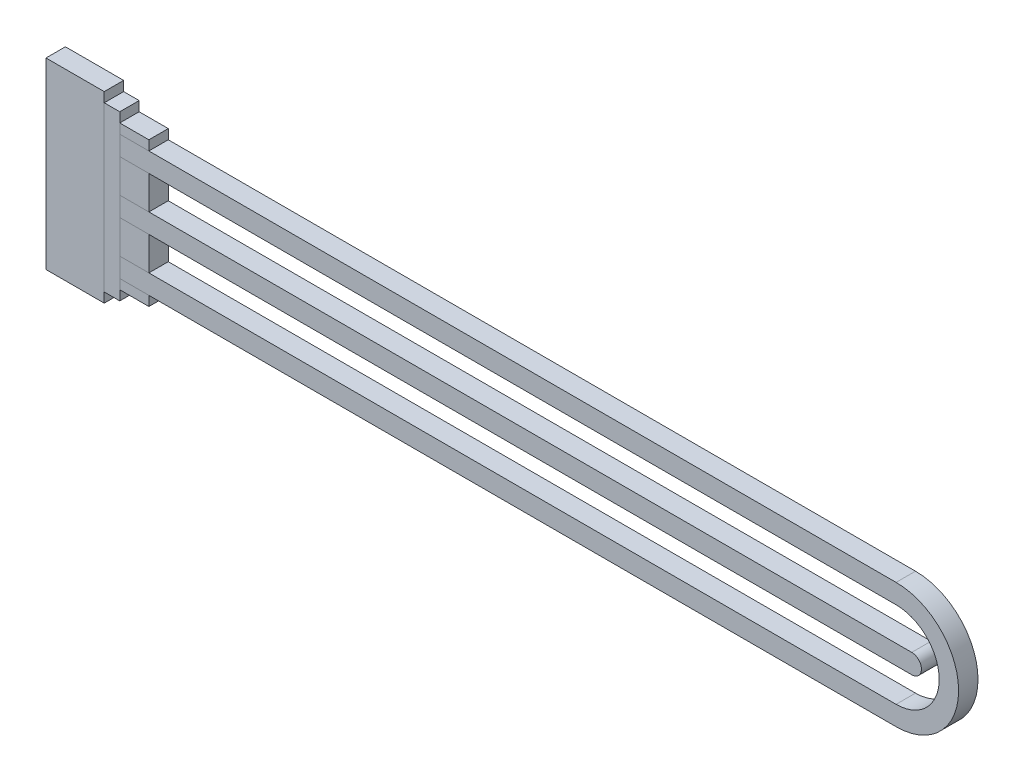
ISO-10303-21;
HEADER;
FILE_DESCRIPTION(('STEP AP214'),'2;1');
FILE_NAME('part.step','',(''),(''),'','','');
FILE_SCHEMA(('AUTOMOTIVE_DESIGN { 1 0 10303 214 1 1 1 1 }'));
ENDSEC;
DATA;
#1=APPLICATION_CONTEXT('core data for automotive mechanical design processes');
#2=APPLICATION_PROTOCOL_DEFINITION('international standard','automotive_design',2000,#1);
#3=PRODUCT_CONTEXT('',#1,'mechanical');
#4=PRODUCT('Part','Part','',(#3));
#5=PRODUCT_RELATED_PRODUCT_CATEGORY('part','',(#4));
#6=PRODUCT_DEFINITION_FORMATION('','',#4);
#7=PRODUCT_DEFINITION_CONTEXT('part definition',#1,'design');
#8=PRODUCT_DEFINITION('design','',#6,#7);
#9=PRODUCT_DEFINITION_SHAPE('','',#8);
#10=(LENGTH_UNIT() NAMED_UNIT(*) SI_UNIT(.MILLI.,.METRE.));
#11=(NAMED_UNIT(*) PLANE_ANGLE_UNIT() SI_UNIT($,.RADIAN.));
#12=(NAMED_UNIT(*) SI_UNIT($,.STERADIAN.) SOLID_ANGLE_UNIT());
#13=UNCERTAINTY_MEASURE_WITH_UNIT(LENGTH_MEASURE(1.E-05),#10,'distance_accuracy_value','');
#14=(GEOMETRIC_REPRESENTATION_CONTEXT(3) GLOBAL_UNCERTAINTY_ASSIGNED_CONTEXT((#13)) GLOBAL_UNIT_ASSIGNED_CONTEXT((#10,
#11,#12)) REPRESENTATION_CONTEXT('',''));
#15=CARTESIAN_POINT('',(0.,0.,0.));
#16=DIRECTION('',(0.,0.,1.));
#17=DIRECTION('',(1.,0.,0.));
#18=AXIS2_PLACEMENT_3D('',#15,#16,#17);
#19=CARTESIAN_POINT('',(-38.,15.,9.99999999999998));
#20=DIRECTION('',(0.,0.,-1.));
#21=DIRECTION('',(-1.,0.,0.));
#22=AXIS2_PLACEMENT_3D('',#19,#20,#21);
#23=PLANE('',#22);
#24=DIRECTION('',(0.,1.,0.));
#25=VECTOR('',#24,1.);
#26=CARTESIAN_POINT('',(-7.99999999999999,15.,9.99999999999998));
#27=LINE('',#26,#25);
#28=CARTESIAN_POINT('',(-7.99999999999999,-79.4096844460773,9.99999999999998));
#29=VERTEX_POINT('',#28);
#30=CARTESIAN_POINT('',(-7.99999999999999,15.,9.99999999999998));
#31=VERTEX_POINT('',#30);
#32=EDGE_CURVE('E115',#29,#31,#27,.T.);
#33=ORIENTED_EDGE('',*,*,#32,.T.);
#34=DIRECTION('',(1.,0.,0.));
#35=VECTOR('',#34,1.);
#36=CARTESIAN_POINT('',(-38.,15.,9.99999999999998));
#37=LINE('',#36,#35);
#38=CARTESIAN_POINT('',(-38.,15.,9.99999999999998));
#39=VERTEX_POINT('',#38);
#40=EDGE_CURVE('E12',#39,#31,#37,.T.);
#41=ORIENTED_EDGE('',*,*,#40,.F.);
#42=DIRECTION('',(0.,1.,0.));
#43=VECTOR('',#42,1.);
#44=CARTESIAN_POINT('',(-38.,15.,9.99999999999998));
#45=LINE('',#44,#43);
#46=CARTESIAN_POINT('',(-38.,-79.4096844460773,9.99999999999998));
#47=VERTEX_POINT('',#46);
#48=EDGE_CURVE('E103',#47,#39,#45,.T.);
#49=ORIENTED_EDGE('',*,*,#48,.F.);
#50=DIRECTION('',(1.,0.,0.));
#51=VECTOR('',#50,1.);
#52=CARTESIAN_POINT('',(-38.,-79.4096844460773,9.99999999999998));
#53=LINE('',#52,#51);
#54=EDGE_CURVE('E111',#47,#29,#53,.T.);
#55=ORIENTED_EDGE('',*,*,#54,.T.);
#56=EDGE_LOOP('',(#33,#41,#49,#55));
#57=FACE_BOUND('',#56,.T.);
#58=ADVANCED_FACE('F52',(#57),#23,.F.);
#59=CARTESIAN_POINT('',(-38.,15.,0.));
#60=DIRECTION('',(0.,-1.,0.));
#61=DIRECTION('',(0.,0.,-1.));
#62=AXIS2_PLACEMENT_3D('',#59,#60,#61);
#63=PLANE('',#62);
#64=DIRECTION('',(0.,0.,-1.));
#65=VECTOR('',#64,1.);
#66=CARTESIAN_POINT('',(-7.99999999999999,15.,0.));
#67=LINE('',#66,#65);
#68=CARTESIAN_POINT('',(-7.99999999999999,15.,0.));
#69=VERTEX_POINT('',#68);
#70=EDGE_CURVE('E107',#31,#69,#67,.T.);
#71=ORIENTED_EDGE('',*,*,#70,.T.);
#72=DIRECTION('',(1.,0.,0.));
#73=VECTOR('',#72,1.);
#74=CARTESIAN_POINT('',(-38.,15.,0.));
#75=LINE('',#74,#73);
#76=CARTESIAN_POINT('',(-38.,15.,0.));
#77=VERTEX_POINT('',#76);
#78=EDGE_CURVE('E60',#77,#69,#75,.T.);
#79=ORIENTED_EDGE('',*,*,#78,.F.);
#80=DIRECTION('',(0.,0.,-1.));
#81=VECTOR('',#80,1.);
#82=CARTESIAN_POINT('',(-38.,15.,0.));
#83=LINE('',#82,#81);
#84=EDGE_CURVE('E98',#39,#77,#83,.T.);
#85=ORIENTED_EDGE('',*,*,#84,.F.);
#86=ORIENTED_EDGE('',*,*,#40,.T.);
#87=EDGE_LOOP('',(#71,#79,#85,#86));
#88=FACE_BOUND('',#87,.T.);
#89=ADVANCED_FACE('F106',(#88),#63,.F.);
#90=CARTESIAN_POINT('',(-38.,15.,0.));
#91=DIRECTION('',(0.,0.,1.));
#92=DIRECTION('',(0.,-1.,0.));
#93=AXIS2_PLACEMENT_3D('',#90,#91,#92);
#94=PLANE('',#93);
#95=DIRECTION('',(0.,-1.,0.));
#96=VECTOR('',#95,1.);
#97=CARTESIAN_POINT('',(-7.99999999999999,15.,0.));
#98=LINE('',#97,#96);
#99=CARTESIAN_POINT('',(-7.99999999999999,-79.4096844460773,0.));
#100=VERTEX_POINT('',#99);
#101=EDGE_CURVE('E85',#69,#100,#98,.T.);
#102=ORIENTED_EDGE('',*,*,#101,.T.);
#103=DIRECTION('',(1.,0.,0.));
#104=VECTOR('',#103,1.);
#105=CARTESIAN_POINT('',(-38.,-79.4096844460773,0.));
#106=LINE('',#105,#104);
#107=CARTESIAN_POINT('',(-38.,-79.4096844460773,0.));
#108=VERTEX_POINT('',#107);
#109=EDGE_CURVE('E108',#108,#100,#106,.T.);
#110=ORIENTED_EDGE('',*,*,#109,.F.);
#111=DIRECTION('',(0.,-1.,0.));
#112=VECTOR('',#111,1.);
#113=CARTESIAN_POINT('',(-38.,15.,0.));
#114=LINE('',#113,#112);
#115=EDGE_CURVE('E101',#77,#108,#114,.T.);
#116=ORIENTED_EDGE('',*,*,#115,.F.);
#117=ORIENTED_EDGE('',*,*,#78,.T.);
#118=EDGE_LOOP('',(#102,#110,#116,#117));
#119=FACE_BOUND('',#118,.T.);
#120=ADVANCED_FACE('F109',(#119),#94,.F.);
#121=CARTESIAN_POINT('',(-38.,-79.4096844460773,0.));
#122=DIRECTION('',(0.,1.,0.));
#123=DIRECTION('',(0.,0.,1.));
#124=AXIS2_PLACEMENT_3D('',#121,#122,#123);
#125=PLANE('',#124);
#126=DIRECTION('',(0.,0.,1.));
#127=VECTOR('',#126,1.);
#128=CARTESIAN_POINT('',(-7.99999999999999,-79.4096844460773,0.));
#129=LINE('',#128,#127);
#130=EDGE_CURVE('E91',#100,#29,#129,.T.);
#131=ORIENTED_EDGE('',*,*,#130,.T.);
#132=ORIENTED_EDGE('',*,*,#54,.F.);
#133=DIRECTION('',(0.,0.,1.));
#134=VECTOR('',#133,1.);
#135=CARTESIAN_POINT('',(-38.,-79.4096844460773,0.));
#136=LINE('',#135,#134);
#137=EDGE_CURVE('E68',#108,#47,#136,.T.);
#138=ORIENTED_EDGE('',*,*,#137,.F.);
#139=ORIENTED_EDGE('',*,*,#109,.T.);
#140=EDGE_LOOP('',(#131,#132,#138,#139));
#141=FACE_BOUND('',#140,.T.);
#142=ADVANCED_FACE('F122',(#141),#125,.F.);
#143=CARTESIAN_POINT('',(-38.,0.,0.));
#144=DIRECTION('',(-1.,0.,0.));
#145=DIRECTION('',(0.,0.,1.));
#146=AXIS2_PLACEMENT_3D('',#143,#144,#145);
#147=PLANE('',#146);
#148=ORIENTED_EDGE('',*,*,#48,.T.);
#149=ORIENTED_EDGE('',*,*,#84,.T.);
#150=ORIENTED_EDGE('',*,*,#115,.T.);
#151=ORIENTED_EDGE('',*,*,#137,.T.);
#152=EDGE_LOOP('',(#148,#149,#150,#151));
#153=FACE_BOUND('',#152,.T.);
#154=ADVANCED_FACE('F99',(#153),#147,.T.);
#155=CARTESIAN_POINT('',(-7.99999999999999,0.,0.));
#156=DIRECTION('',(-1.,0.,0.));
#157=DIRECTION('',(0.,0.,1.));
#158=AXIS2_PLACEMENT_3D('',#155,#156,#157);
#159=PLANE('',#158);
#160=ORIENTED_EDGE('',*,*,#32,.F.);
#161=ORIENTED_EDGE('',*,*,#130,.F.);
#162=ORIENTED_EDGE('',*,*,#101,.F.);
#163=ORIENTED_EDGE('',*,*,#70,.F.);
#164=EDGE_LOOP('',(#160,#161,#162,#163));
#165=FACE_BOUND('',#164,.T.);
#166=ADVANCED_FACE('F125',(#165),#159,.F.);
#167=CLOSED_SHELL('',(#58,#89,#120,#142,#154,#166));
#168=MANIFOLD_SOLID_BREP('B2',#167);
#169=CARTESIAN_POINT('',(-7.99999999999999,10.,9.99999999999998));
#170=DIRECTION('',(0.,0.,-1.));
#171=DIRECTION('',(-1.,0.,0.));
#172=AXIS2_PLACEMENT_3D('',#169,#170,#171);
#173=PLANE('',#172);
#174=DIRECTION('',(0.,1.,0.));
#175=VECTOR('',#174,1.);
#176=CARTESIAN_POINT('',(0.,10.,9.99999999999998));
#177=LINE('',#176,#175);
#178=CARTESIAN_POINT('',(0.,-74.4096844460773,9.99999999999998));
#179=VERTEX_POINT('',#178);
#180=CARTESIAN_POINT('',(0.,10.,9.99999999999998));
#181=VERTEX_POINT('',#180);
#182=EDGE_CURVE('E261',#179,#181,#177,.T.);
#183=ORIENTED_EDGE('',*,*,#182,.T.);
#184=DIRECTION('',(1.,0.,0.));
#185=VECTOR('',#184,1.);
#186=CARTESIAN_POINT('',(-7.99999999999999,10.,9.99999999999998));
#187=LINE('',#186,#185);
#188=CARTESIAN_POINT('',(-7.99999999999999,10.,9.99999999999998));
#189=VERTEX_POINT('',#188);
#190=EDGE_CURVE('E50',#189,#181,#187,.T.);
#191=ORIENTED_EDGE('',*,*,#190,.F.);
#192=DIRECTION('',(0.,1.,0.));
#193=VECTOR('',#192,1.);
#194=CARTESIAN_POINT('',(-7.99999999999999,10.,9.99999999999998));
#195=LINE('',#194,#193);
#196=CARTESIAN_POINT('',(-7.99999999999999,-74.4096844460773,9.99999999999998));
#197=VERTEX_POINT('',#196);
#198=EDGE_CURVE('E249',#197,#189,#195,.T.);
#199=ORIENTED_EDGE('',*,*,#198,.F.);
#200=DIRECTION('',(1.,0.,0.));
#201=VECTOR('',#200,1.);
#202=CARTESIAN_POINT('',(-7.99999999999999,-74.4096844460773,9.99999999999998));
#203=LINE('',#202,#201);
#204=EDGE_CURVE('E257',#197,#179,#203,.T.);
#205=ORIENTED_EDGE('',*,*,#204,.T.);
#206=EDGE_LOOP('',(#183,#191,#199,#205));
#207=FACE_BOUND('',#206,.T.);
#208=ADVANCED_FACE('F198',(#207),#173,.F.);
#209=CARTESIAN_POINT('',(-7.99999999999999,10.,0.));
#210=DIRECTION('',(0.,-1.,0.));
#211=DIRECTION('',(0.,0.,-1.));
#212=AXIS2_PLACEMENT_3D('',#209,#210,#211);
#213=PLANE('',#212);
#214=DIRECTION('',(0.,0.,-1.));
#215=VECTOR('',#214,1.);
#216=CARTESIAN_POINT('',(0.,10.,0.));
#217=LINE('',#216,#215);
#218=CARTESIAN_POINT('',(0.,10.,0.));
#219=VERTEX_POINT('',#218);
#220=EDGE_CURVE('E253',#181,#219,#217,.T.);
#221=ORIENTED_EDGE('',*,*,#220,.T.);
#222=DIRECTION('',(1.,0.,0.));
#223=VECTOR('',#222,1.);
#224=CARTESIAN_POINT('',(-7.99999999999999,10.,0.));
#225=LINE('',#224,#223);
#226=CARTESIAN_POINT('',(-7.99999999999999,10.,0.));
#227=VERTEX_POINT('',#226);
#228=EDGE_CURVE('E206',#227,#219,#225,.T.);
#229=ORIENTED_EDGE('',*,*,#228,.F.);
#230=DIRECTION('',(0.,0.,-1.));
#231=VECTOR('',#230,1.);
#232=CARTESIAN_POINT('',(-7.99999999999999,10.,0.));
#233=LINE('',#232,#231);
#234=EDGE_CURVE('E244',#189,#227,#233,.T.);
#235=ORIENTED_EDGE('',*,*,#234,.F.);
#236=ORIENTED_EDGE('',*,*,#190,.T.);
#237=EDGE_LOOP('',(#221,#229,#235,#236));
#238=FACE_BOUND('',#237,.T.);
#239=ADVANCED_FACE('F252',(#238),#213,.F.);
#240=CARTESIAN_POINT('',(-7.99999999999999,10.,0.));
#241=DIRECTION('',(0.,0.,1.));
#242=DIRECTION('',(1.,0.,0.));
#243=AXIS2_PLACEMENT_3D('',#240,#241,#242);
#244=PLANE('',#243);
#245=DIRECTION('',(0.,-1.,0.));
#246=VECTOR('',#245,1.);
#247=CARTESIAN_POINT('',(0.,10.,0.));
#248=LINE('',#247,#246);
#249=CARTESIAN_POINT('',(0.,-74.4096844460773,0.));
#250=VERTEX_POINT('',#249);
#251=EDGE_CURVE('E231',#219,#250,#248,.T.);
#252=ORIENTED_EDGE('',*,*,#251,.T.);
#253=DIRECTION('',(1.,0.,0.));
#254=VECTOR('',#253,1.);
#255=CARTESIAN_POINT('',(-7.99999999999999,-74.4096844460773,0.));
#256=LINE('',#255,#254);
#257=CARTESIAN_POINT('',(-7.99999999999999,-74.4096844460773,0.));
#258=VERTEX_POINT('',#257);
#259=EDGE_CURVE('E254',#258,#250,#256,.T.);
#260=ORIENTED_EDGE('',*,*,#259,.F.);
#261=DIRECTION('',(0.,-1.,0.));
#262=VECTOR('',#261,1.);
#263=CARTESIAN_POINT('',(-7.99999999999999,10.,0.));
#264=LINE('',#263,#262);
#265=EDGE_CURVE('E247',#227,#258,#264,.T.);
#266=ORIENTED_EDGE('',*,*,#265,.F.);
#267=ORIENTED_EDGE('',*,*,#228,.T.);
#268=EDGE_LOOP('',(#252,#260,#266,#267));
#269=FACE_BOUND('',#268,.T.);
#270=ADVANCED_FACE('F255',(#269),#244,.F.);
#271=CARTESIAN_POINT('',(-7.99999999999999,-74.4096844460773,0.));
#272=DIRECTION('',(0.,1.,0.));
#273=DIRECTION('',(0.,0.,1.));
#274=AXIS2_PLACEMENT_3D('',#271,#272,#273);
#275=PLANE('',#274);
#276=DIRECTION('',(0.,0.,1.));
#277=VECTOR('',#276,1.);
#278=CARTESIAN_POINT('',(0.,-74.4096844460773,0.));
#279=LINE('',#278,#277);
#280=EDGE_CURVE('E237',#250,#179,#279,.T.);
#281=ORIENTED_EDGE('',*,*,#280,.T.);
#282=ORIENTED_EDGE('',*,*,#204,.F.);
#283=DIRECTION('',(0.,0.,1.));
#284=VECTOR('',#283,1.);
#285=CARTESIAN_POINT('',(-7.99999999999999,-74.4096844460773,0.));
#286=LINE('',#285,#284);
#287=EDGE_CURVE('E214',#258,#197,#286,.T.);
#288=ORIENTED_EDGE('',*,*,#287,.F.);
#289=ORIENTED_EDGE('',*,*,#259,.T.);
#290=EDGE_LOOP('',(#281,#282,#288,#289));
#291=FACE_BOUND('',#290,.T.);
#292=ADVANCED_FACE('F268',(#291),#275,.F.);
#293=CARTESIAN_POINT('',(-7.99999999999999,0.,0.));
#294=DIRECTION('',(-1.,0.,0.));
#295=DIRECTION('',(0.,0.,1.));
#296=AXIS2_PLACEMENT_3D('',#293,#294,#295);
#297=PLANE('',#296);
#298=ORIENTED_EDGE('',*,*,#198,.T.);
#299=ORIENTED_EDGE('',*,*,#234,.T.);
#300=ORIENTED_EDGE('',*,*,#265,.T.);
#301=ORIENTED_EDGE('',*,*,#287,.T.);
#302=EDGE_LOOP('',(#298,#299,#300,#301));
#303=FACE_BOUND('',#302,.T.);
#304=ADVANCED_FACE('F245',(#303),#297,.T.);
#305=CARTESIAN_POINT('',(0.,0.,0.));
#306=DIRECTION('',(-1.,0.,0.));
#307=DIRECTION('',(0.,0.,1.));
#308=AXIS2_PLACEMENT_3D('',#305,#306,#307);
#309=PLANE('',#308);
#310=ORIENTED_EDGE('',*,*,#182,.F.);
#311=ORIENTED_EDGE('',*,*,#280,.F.);
#312=ORIENTED_EDGE('',*,*,#251,.F.);
#313=ORIENTED_EDGE('',*,*,#220,.F.);
#314=EDGE_LOOP('',(#310,#311,#312,#313));
#315=FACE_BOUND('',#314,.T.);
#316=ADVANCED_FACE('F271',(#315),#309,.F.);
#317=CLOSED_SHELL('',(#208,#239,#270,#292,#304,#316));
#318=MANIFOLD_SOLID_BREP('B6',#317);
#319=CARTESIAN_POINT('',(15.,5.,10.));
#320=DIRECTION('',(0.,0.,-1.));
#321=DIRECTION('',(0.,1.,0.));
#322=AXIS2_PLACEMENT_3D('',#319,#320,#321);
#323=PLANE('',#322);
#324=DIRECTION('',(0.,-1.,0.));
#325=VECTOR('',#324,1.);
#326=CARTESIAN_POINT('',(0.,5.,10.));
#327=LINE('',#326,#325);
#328=CARTESIAN_POINT('',(0.,5.,10.));
#329=VERTEX_POINT('',#328);
#330=CARTESIAN_POINT('',(0.,-69.4096844460773,10.));
#331=VERTEX_POINT('',#330);
#332=EDGE_CURVE('E405',#329,#331,#327,.T.);
#333=ORIENTED_EDGE('',*,*,#332,.T.);
#334=DIRECTION('',(-1.,0.,0.));
#335=VECTOR('',#334,1.);
#336=CARTESIAN_POINT('',(15.,-69.4096844460773,10.));
#337=LINE('',#336,#335);
#338=CARTESIAN_POINT('',(15.,-69.4096844460773,10.));
#339=VERTEX_POINT('',#338);
#340=EDGE_CURVE('E196',#339,#331,#337,.T.);
#341=ORIENTED_EDGE('',*,*,#340,.F.);
#342=DIRECTION('',(0.,-1.,0.));
#343=VECTOR('',#342,1.);
#344=CARTESIAN_POINT('',(15.,5.,10.));
#345=LINE('',#344,#343);
#346=CARTESIAN_POINT('',(15.,5.,10.));
#347=VERTEX_POINT('',#346);
#348=EDGE_CURVE('E393',#347,#339,#345,.T.);
#349=ORIENTED_EDGE('',*,*,#348,.F.);
#350=DIRECTION('',(-1.,0.,0.));
#351=VECTOR('',#350,1.);
#352=CARTESIAN_POINT('',(15.,5.,10.));
#353=LINE('',#352,#351);
#354=EDGE_CURVE('E401',#347,#329,#353,.T.);
#355=ORIENTED_EDGE('',*,*,#354,.T.);
#356=EDGE_LOOP('',(#333,#341,#349,#355));
#357=FACE_BOUND('',#356,.T.);
#358=ADVANCED_FACE('F342',(#357),#323,.F.);
#359=CARTESIAN_POINT('',(15.,-69.4096844460773,0.));
#360=DIRECTION('',(0.,1.,0.));
#361=DIRECTION('',(0.,0.,1.));
#362=AXIS2_PLACEMENT_3D('',#359,#360,#361);
#363=PLANE('',#362);
#364=DIRECTION('',(0.,0.,-1.));
#365=VECTOR('',#364,1.);
#366=CARTESIAN_POINT('',(0.,-69.4096844460773,0.));
#367=LINE('',#366,#365);
#368=CARTESIAN_POINT('',(0.,-69.4096844460773,0.));
#369=VERTEX_POINT('',#368);
#370=EDGE_CURVE('E397',#331,#369,#367,.T.);
#371=ORIENTED_EDGE('',*,*,#370,.T.);
#372=DIRECTION('',(-1.,0.,0.));
#373=VECTOR('',#372,1.);
#374=CARTESIAN_POINT('',(15.,-69.4096844460773,0.));
#375=LINE('',#374,#373);
#376=CARTESIAN_POINT('',(15.,-69.4096844460773,0.));
#377=VERTEX_POINT('',#376);
#378=EDGE_CURVE('E350',#377,#369,#375,.T.);
#379=ORIENTED_EDGE('',*,*,#378,.F.);
#380=DIRECTION('',(0.,0.,-1.));
#381=VECTOR('',#380,1.);
#382=CARTESIAN_POINT('',(15.,-69.4096844460773,0.));
#383=LINE('',#382,#381);
#384=EDGE_CURVE('E388',#339,#377,#383,.T.);
#385=ORIENTED_EDGE('',*,*,#384,.F.);
#386=ORIENTED_EDGE('',*,*,#340,.T.);
#387=EDGE_LOOP('',(#371,#379,#385,#386));
#388=FACE_BOUND('',#387,.T.);
#389=ADVANCED_FACE('F396',(#388),#363,.F.);
#390=CARTESIAN_POINT('',(15.,5.,0.));
#391=DIRECTION('',(0.,0.,1.));
#392=DIRECTION('',(0.,-1.,0.));
#393=AXIS2_PLACEMENT_3D('',#390,#391,#392);
#394=PLANE('',#393);
#395=DIRECTION('',(0.,1.,0.));
#396=VECTOR('',#395,1.);
#397=CARTESIAN_POINT('',(0.,5.,0.));
#398=LINE('',#397,#396);
#399=CARTESIAN_POINT('',(0.,5.,0.));
#400=VERTEX_POINT('',#399);
#401=EDGE_CURVE('E375',#369,#400,#398,.T.);
#402=ORIENTED_EDGE('',*,*,#401,.T.);
#403=DIRECTION('',(-1.,0.,0.));
#404=VECTOR('',#403,1.);
#405=CARTESIAN_POINT('',(15.,5.,0.));
#406=LINE('',#405,#404);
#407=CARTESIAN_POINT('',(15.,5.,0.));
#408=VERTEX_POINT('',#407);
#409=EDGE_CURVE('E398',#408,#400,#406,.T.);
#410=ORIENTED_EDGE('',*,*,#409,.F.);
#411=DIRECTION('',(0.,1.,0.));
#412=VECTOR('',#411,1.);
#413=CARTESIAN_POINT('',(15.,5.,0.));
#414=LINE('',#413,#412);
#415=EDGE_CURVE('E391',#377,#408,#414,.T.);
#416=ORIENTED_EDGE('',*,*,#415,.F.);
#417=ORIENTED_EDGE('',*,*,#378,.T.);
#418=EDGE_LOOP('',(#402,#410,#416,#417));
#419=FACE_BOUND('',#418,.T.);
#420=ADVANCED_FACE('F399',(#419),#394,.F.);
#421=CARTESIAN_POINT('',(15.,5.,0.));
#422=DIRECTION('',(0.,-1.,0.));
#423=DIRECTION('',(0.,0.,-1.));
#424=AXIS2_PLACEMENT_3D('',#421,#422,#423);
#425=PLANE('',#424);
#426=DIRECTION('',(0.,0.,1.));
#427=VECTOR('',#426,1.);
#428=CARTESIAN_POINT('',(0.,5.,0.));
#429=LINE('',#428,#427);
#430=EDGE_CURVE('E381',#400,#329,#429,.T.);
#431=ORIENTED_EDGE('',*,*,#430,.T.);
#432=ORIENTED_EDGE('',*,*,#354,.F.);
#433=DIRECTION('',(0.,0.,1.));
#434=VECTOR('',#433,1.);
#435=CARTESIAN_POINT('',(15.,5.,0.));
#436=LINE('',#435,#434);
#437=EDGE_CURVE('E358',#408,#347,#436,.T.);
#438=ORIENTED_EDGE('',*,*,#437,.F.);
#439=ORIENTED_EDGE('',*,*,#409,.T.);
#440=EDGE_LOOP('',(#431,#432,#438,#439));
#441=FACE_BOUND('',#440,.T.);
#442=ADVANCED_FACE('F412',(#441),#425,.F.);
#443=CARTESIAN_POINT('',(15.,0.,0.));
#444=DIRECTION('',(-1.,0.,0.));
#445=DIRECTION('',(0.,0.,1.));
#446=AXIS2_PLACEMENT_3D('',#443,#444,#445);
#447=PLANE('',#446);
#448=ORIENTED_EDGE('',*,*,#348,.T.);
#449=ORIENTED_EDGE('',*,*,#384,.T.);
#450=ORIENTED_EDGE('',*,*,#415,.T.);
#451=ORIENTED_EDGE('',*,*,#437,.T.);
#452=EDGE_LOOP('',(#448,#449,#450,#451));
#453=FACE_BOUND('',#452,.T.);
#454=ADVANCED_FACE('F389',(#453),#447,.F.);
#455=CARTESIAN_POINT('',(0.,0.,0.));
#456=DIRECTION('',(-1.,0.,0.));
#457=DIRECTION('',(0.,0.,1.));
#458=AXIS2_PLACEMENT_3D('',#455,#456,#457);
#459=PLANE('',#458);
#460=ORIENTED_EDGE('',*,*,#332,.F.);
#461=ORIENTED_EDGE('',*,*,#430,.F.);
#462=ORIENTED_EDGE('',*,*,#401,.F.);
#463=ORIENTED_EDGE('',*,*,#370,.F.);
#464=EDGE_LOOP('',(#460,#461,#462,#463));
#465=FACE_BOUND('',#464,.T.);
#466=ADVANCED_FACE('F415',(#465),#459,.T.);
#467=CLOSED_SHELL('',(#358,#389,#420,#442,#454,#466));
#468=MANIFOLD_SOLID_BREP('B44',#467);
#469=CARTESIAN_POINT('',(-15.,-59.4096844460773,5.));
#470=DIRECTION('',(1.,0.,0.));
#471=DIRECTION('',(0.,0.,-1.));
#472=AXIS2_PLACEMENT_3D('',#469,#470,#471);
#473=CYLINDRICAL_SURFACE('',#472,3.);
#474=CARTESIAN_POINT('',(-15.,-59.4096844460773,5.));
#475=DIRECTION('',(-1.,0.,0.));
#476=DIRECTION('',(0.,0.,1.));
#477=AXIS2_PLACEMENT_3D('',#474,#475,#476);
#478=CIRCLE('',#477,3.);
#479=CARTESIAN_POINT('',(-15.,-59.4096844460773,8.));
#480=VERTEX_POINT('',#479);
#481=EDGE_CURVE('E341',#480,#480,#478,.T.);
#482=ORIENTED_EDGE('',*,*,#481,.F.);
#483=EDGE_LOOP('',(#482));
#484=FACE_BOUND('',#483,.T.);
#485=CARTESIAN_POINT('',(0.,-59.4096844460773,5.));
#486=DIRECTION('',(-1.,0.,0.));
#487=DIRECTION('',(0.,0.,1.));
#488=AXIS2_PLACEMENT_3D('',#485,#486,#487);
#489=CIRCLE('',#488,3.);
#490=CARTESIAN_POINT('',(0.,-59.4096844460773,8.));
#491=VERTEX_POINT('',#490);
#492=EDGE_CURVE('E489',#491,#491,#489,.T.);
#493=ORIENTED_EDGE('',*,*,#492,.T.);
#494=EDGE_LOOP('',(#493));
#495=FACE_BOUND('',#494,.T.);
#496=ADVANCED_FACE('F486',(#484,#495),#473,.T.);
#497=CARTESIAN_POINT('',(-15.,-59.4096844460773,5.));
#498=DIRECTION('',(-1.,0.,0.));
#499=DIRECTION('',(0.,0.,1.));
#500=AXIS2_PLACEMENT_3D('',#497,#498,#499);
#501=PLANE('',#500);
#502=ORIENTED_EDGE('',*,*,#481,.T.);
#503=EDGE_LOOP('',(#502));
#504=FACE_BOUND('',#503,.T.);
#505=ADVANCED_FACE('F501',(#504),#501,.T.);
#506=CARTESIAN_POINT('',(0.,-59.4096844460773,5.));
#507=DIRECTION('',(-1.,0.,0.));
#508=DIRECTION('',(0.,0.,1.));
#509=AXIS2_PLACEMENT_3D('',#506,#507,#508);
#510=PLANE('',#509);
#511=ORIENTED_EDGE('',*,*,#492,.F.);
#512=EDGE_LOOP('',(#511));
#513=FACE_BOUND('',#512,.T.);
#514=ADVANCED_FACE('F499',(#513),#510,.F.);
#515=CLOSED_SHELL('',(#496,#505,#514));
#516=MANIFOLD_SOLID_BREP('B190',#515);
#517=CARTESIAN_POINT('',(-15.,-4.90697990871341,5.));
#518=DIRECTION('',(1.,0.,0.));
#519=DIRECTION('',(0.,0.,-1.));
#520=AXIS2_PLACEMENT_3D('',#517,#518,#519);
#521=CYLINDRICAL_SURFACE('',#520,3.);
#522=CARTESIAN_POINT('',(-15.,-4.90697990871341,5.));
#523=DIRECTION('',(-1.,0.,0.));
#524=DIRECTION('',(0.,0.,1.));
#525=AXIS2_PLACEMENT_3D('',#522,#523,#524);
#526=CIRCLE('',#525,3.);
#527=CARTESIAN_POINT('',(-15.,-4.90697990871341,8.));
#528=VERTEX_POINT('',#527);
#529=EDGE_CURVE('E485',#528,#528,#526,.T.);
#530=ORIENTED_EDGE('',*,*,#529,.F.);
#531=EDGE_LOOP('',(#530));
#532=FACE_BOUND('',#531,.T.);
#533=CARTESIAN_POINT('',(0.,-4.90697990871341,5.));
#534=DIRECTION('',(-1.,0.,0.));
#535=DIRECTION('',(0.,0.,1.));
#536=AXIS2_PLACEMENT_3D('',#533,#534,#535);
#537=CIRCLE('',#536,3.);
#538=CARTESIAN_POINT('',(0.,-4.90697990871341,8.));
#539=VERTEX_POINT('',#538);
#540=EDGE_CURVE('E546',#539,#539,#537,.T.);
#541=ORIENTED_EDGE('',*,*,#540,.T.);
#542=EDGE_LOOP('',(#541));
#543=FACE_BOUND('',#542,.T.);
#544=ADVANCED_FACE('F543',(#532,#543),#521,.T.);
#545=CARTESIAN_POINT('',(-15.,-4.90697990871341,5.));
#546=DIRECTION('',(-1.,0.,0.));
#547=DIRECTION('',(0.,0.,1.));
#548=AXIS2_PLACEMENT_3D('',#545,#546,#547);
#549=PLANE('',#548);
#550=ORIENTED_EDGE('',*,*,#529,.T.);
#551=EDGE_LOOP('',(#550));
#552=FACE_BOUND('',#551,.T.);
#553=ADVANCED_FACE('F558',(#552),#549,.T.);
#554=CARTESIAN_POINT('',(0.,-4.90697990871341,5.));
#555=DIRECTION('',(-1.,0.,0.));
#556=DIRECTION('',(0.,0.,1.));
#557=AXIS2_PLACEMENT_3D('',#554,#555,#556);
#558=PLANE('',#557);
#559=ORIENTED_EDGE('',*,*,#540,.F.);
#560=EDGE_LOOP('',(#559));
#561=FACE_BOUND('',#560,.T.);
#562=ADVANCED_FACE('F556',(#561),#558,.F.);
#563=CLOSED_SHELL('',(#544,#553,#562));
#564=MANIFOLD_SOLID_BREP('B336',#563);
#565=CARTESIAN_POINT('',(0.,-27.2048422230386,10.));
#566=DIRECTION('',(1.,0.,0.));
#567=DIRECTION('',(0.,1.,0.));
#568=AXIS2_PLACEMENT_3D('',#565,#566,#567);
#569=PLANE('',#568);
#570=DIRECTION('',(0.,-1.,0.));
#571=VECTOR('',#570,1.);
#572=CARTESIAN_POINT('',(0.,-27.2048422230386,0.));
#573=LINE('',#572,#571);
#574=CARTESIAN_POINT('',(0.,-27.2048422230386,0.));
#575=VERTEX_POINT('',#574);
#576=CARTESIAN_POINT('',(0.,-37.2048422230386,0.));
#577=VERTEX_POINT('',#576);
#578=EDGE_CURVE('E541',#575,#577,#573,.T.);
#579=ORIENTED_EDGE('',*,*,#578,.T.);
#580=DIRECTION('',(0.,0.,-1.));
#581=VECTOR('',#580,1.);
#582=CARTESIAN_POINT('',(0.,-37.2048422230386,10.));
#583=LINE('',#582,#581);
#584=CARTESIAN_POINT('',(0.,-37.2048422230386,10.));
#585=VERTEX_POINT('',#584);
#586=EDGE_CURVE('E670',#585,#577,#583,.T.);
#587=ORIENTED_EDGE('',*,*,#586,.F.);
#588=DIRECTION('',(0.,-1.,0.));
#589=VECTOR('',#588,1.);
#590=CARTESIAN_POINT('',(0.,-27.2048422230386,10.));
#591=LINE('',#590,#589);
#592=CARTESIAN_POINT('',(0.,-27.2048422230386,10.));
#593=VERTEX_POINT('',#592);
#594=EDGE_CURVE('E603',#593,#585,#591,.T.);
#595=ORIENTED_EDGE('',*,*,#594,.F.);
#596=DIRECTION('',(0.,0.,-1.));
#597=VECTOR('',#596,1.);
#598=CARTESIAN_POINT('',(0.,-27.2048422230386,10.));
#599=LINE('',#598,#597);
#600=EDGE_CURVE('E658',#593,#575,#599,.T.);
#601=ORIENTED_EDGE('',*,*,#600,.T.);
#602=EDGE_LOOP('',(#579,#587,#595,#601));
#603=FACE_BOUND('',#602,.T.);
#604=ADVANCED_FACE('F599',(#603),#569,.F.);
#605=CARTESIAN_POINT('',(0.,-37.2048422230386,10.));
#606=DIRECTION('',(0.,1.,0.));
#607=DIRECTION('',(-1.,0.,0.));
#608=AXIS2_PLACEMENT_3D('',#605,#606,#607);
#609=PLANE('',#608);
#610=DIRECTION('',(1.,0.,0.));
#611=VECTOR('',#610,1.);
#612=CARTESIAN_POINT('',(0.,-37.2048422230386,0.));
#613=LINE('',#612,#611);
#614=CARTESIAN_POINT('',(408.064158914082,-37.2048422230385,0.));
#615=VERTEX_POINT('',#614);
#616=EDGE_CURVE('E609',#577,#615,#613,.T.);
#617=ORIENTED_EDGE('',*,*,#616,.T.);
#618=DIRECTION('',(0.,0.,-1.));
#619=VECTOR('',#618,1.);
#620=CARTESIAN_POINT('',(408.064158914082,-37.2048422230385,10.));
#621=LINE('',#620,#619);
#622=CARTESIAN_POINT('',(408.064158914082,-37.2048422230385,10.));
#623=VERTEX_POINT('',#622);
#624=EDGE_CURVE('E654',#623,#615,#621,.T.);
#625=ORIENTED_EDGE('',*,*,#624,.F.);
#626=DIRECTION('',(1.,0.,0.));
#627=VECTOR('',#626,1.);
#628=CARTESIAN_POINT('',(0.,-37.2048422230386,10.));
#629=LINE('',#628,#627);
#630=EDGE_CURVE('E633',#585,#623,#629,.T.);
#631=ORIENTED_EDGE('',*,*,#630,.F.);
#632=ORIENTED_EDGE('',*,*,#586,.T.);
#633=EDGE_LOOP('',(#617,#625,#631,#632));
#634=FACE_BOUND('',#633,.T.);
#635=ADVANCED_FACE('F673',(#634),#609,.F.);
#636=CARTESIAN_POINT('',(408.064158914082,-32.2048422230385,10.));
#637=DIRECTION('',(0.,0.,-1.));
#638=DIRECTION('',(-1.,0.,0.));
#639=AXIS2_PLACEMENT_3D('',#636,#637,#638);
#640=CYLINDRICAL_SURFACE('',#639,5.);
#641=CARTESIAN_POINT('',(408.064158914082,-32.2048422230385,0.));
#642=DIRECTION('',(0.,0.,1.));
#643=DIRECTION('',(-1.,0.,0.));
#644=AXIS2_PLACEMENT_3D('',#641,#642,#643);
#645=CIRCLE('',#644,5.);
#646=CARTESIAN_POINT('',(408.064158914082,-27.2048422230385,0.));
#647=VERTEX_POINT('',#646);
#648=EDGE_CURVE('E649',#615,#647,#645,.T.);
#649=ORIENTED_EDGE('',*,*,#648,.T.);
#650=DIRECTION('',(0.,0.,-1.));
#651=VECTOR('',#650,1.);
#652=CARTESIAN_POINT('',(408.064158914082,-27.2048422230385,10.));
#653=LINE('',#652,#651);
#654=CARTESIAN_POINT('',(408.064158914082,-27.2048422230385,10.));
#655=VERTEX_POINT('',#654);
#656=EDGE_CURVE('E652',#655,#647,#653,.T.);
#657=ORIENTED_EDGE('',*,*,#656,.F.);
#658=CARTESIAN_POINT('',(408.064158914082,-32.2048422230385,10.));
#659=DIRECTION('',(0.,0.,1.));
#660=DIRECTION('',(-1.,0.,0.));
#661=AXIS2_PLACEMENT_3D('',#658,#659,#660);
#662=CIRCLE('',#661,5.);
#663=EDGE_CURVE('E666',#623,#655,#662,.T.);
#664=ORIENTED_EDGE('',*,*,#663,.F.);
#665=ORIENTED_EDGE('',*,*,#624,.T.);
#666=EDGE_LOOP('',(#649,#657,#664,#665));
#667=FACE_BOUND('',#666,.T.);
#668=ADVANCED_FACE('F650',(#667),#640,.T.);
#669=CARTESIAN_POINT('',(0.,-27.2048422230386,10.));
#670=DIRECTION('',(0.,-1.,0.));
#671=DIRECTION('',(1.,0.,0.));
#672=AXIS2_PLACEMENT_3D('',#669,#670,#671);
#673=PLANE('',#672);
#674=DIRECTION('',(-1.,0.,0.));
#675=VECTOR('',#674,1.);
#676=CARTESIAN_POINT('',(0.,-27.2048422230386,0.));
#677=LINE('',#676,#675);
#678=EDGE_CURVE('E643',#647,#575,#677,.T.);
#679=ORIENTED_EDGE('',*,*,#678,.T.);
#680=ORIENTED_EDGE('',*,*,#600,.F.);
#681=DIRECTION('',(-1.,0.,0.));
#682=VECTOR('',#681,1.);
#683=CARTESIAN_POINT('',(0.,-27.2048422230386,10.));
#684=LINE('',#683,#682);
#685=EDGE_CURVE('E657',#655,#593,#684,.T.);
#686=ORIENTED_EDGE('',*,*,#685,.F.);
#687=ORIENTED_EDGE('',*,*,#656,.T.);
#688=EDGE_LOOP('',(#679,#680,#686,#687));
#689=FACE_BOUND('',#688,.T.);
#690=ADVANCED_FACE('F656',(#689),#673,.F.);
#691=CARTESIAN_POINT('',(408.064158914082,-32.2048422230385,10.));
#692=DIRECTION('',(0.,0.,-1.));
#693=DIRECTION('',(-1.,0.,0.));
#694=AXIS2_PLACEMENT_3D('',#691,#692,#693);
#695=PLANE('',#694);
#696=ORIENTED_EDGE('',*,*,#594,.T.);
#697=ORIENTED_EDGE('',*,*,#630,.T.);
#698=ORIENTED_EDGE('',*,*,#663,.T.);
#699=ORIENTED_EDGE('',*,*,#685,.T.);
#700=EDGE_LOOP('',(#696,#697,#698,#699));
#701=FACE_BOUND('',#700,.T.);
#702=ADVANCED_FACE('F601',(#701),#695,.F.);
#703=CARTESIAN_POINT('',(408.064158914082,-32.2048422230385,0.));
#704=DIRECTION('',(0.,0.,-1.));
#705=DIRECTION('',(-1.,0.,0.));
#706=AXIS2_PLACEMENT_3D('',#703,#704,#705);
#707=PLANE('',#706);
#708=ORIENTED_EDGE('',*,*,#578,.F.);
#709=ORIENTED_EDGE('',*,*,#678,.F.);
#710=ORIENTED_EDGE('',*,*,#648,.F.);
#711=ORIENTED_EDGE('',*,*,#616,.F.);
#712=EDGE_LOOP('',(#708,#709,#710,#711));
#713=FACE_BOUND('',#712,.T.);
#714=ADVANCED_FACE('F660',(#713),#707,.T.);
#715=CLOSED_SHELL('',(#604,#635,#668,#690,#702,#714));
#716=MANIFOLD_SOLID_BREP('B480',#715);
#717=CARTESIAN_POINT('',(0.,-10.,10.));
#718=DIRECTION('',(1.,0.,0.));
#719=DIRECTION('',(0.,0.,-1.));
#720=AXIS2_PLACEMENT_3D('',#717,#718,#719);
#721=PLANE('',#720);
#722=DIRECTION('',(0.,-1.,0.));
#723=VECTOR('',#722,1.);
#724=CARTESIAN_POINT('',(0.,-10.,0.));
#725=LINE('',#724,#723);
#726=CARTESIAN_POINT('',(0.,0.,0.));
#727=VERTEX_POINT('',#726);
#728=CARTESIAN_POINT('',(0.,-10.,0.));
#729=VERTEX_POINT('',#728);
#730=EDGE_CURVE('E831',#727,#729,#725,.T.);
#731=ORIENTED_EDGE('',*,*,#730,.T.);
#732=DIRECTION('',(0.,0.,-1.));
#733=VECTOR('',#732,1.);
#734=CARTESIAN_POINT('',(0.,-10.,10.));
#735=LINE('',#734,#733);
#736=CARTESIAN_POINT('',(0.,-10.,10.));
#737=VERTEX_POINT('',#736);
#738=EDGE_CURVE('E597',#737,#729,#735,.T.);
#739=ORIENTED_EDGE('',*,*,#738,.F.);
#740=DIRECTION('',(0.,-1.,0.));
#741=VECTOR('',#740,1.);
#742=CARTESIAN_POINT('',(0.,-10.,10.));
#743=LINE('',#742,#741);
#744=CARTESIAN_POINT('',(0.,0.,10.));
#745=VERTEX_POINT('',#744);
#746=EDGE_CURVE('E845',#745,#737,#743,.T.);
#747=ORIENTED_EDGE('',*,*,#746,.F.);
#748=DIRECTION('',(0.,0.,-1.));
#749=VECTOR('',#748,1.);
#750=CARTESIAN_POINT('',(0.,0.,10.));
#751=LINE('',#750,#749);
#752=EDGE_CURVE('E827',#745,#727,#751,.T.);
#753=ORIENTED_EDGE('',*,*,#752,.T.);
#754=EDGE_LOOP('',(#731,#739,#747,#753));
#755=FACE_BOUND('',#754,.T.);
#756=ADVANCED_FACE('F735',(#755),#721,.F.);
#757=CARTESIAN_POINT('',(0.,-10.,10.));
#758=DIRECTION('',(0.,1.,0.));
#759=DIRECTION('',(0.,0.,1.));
#760=AXIS2_PLACEMENT_3D('',#757,#758,#759);
#761=PLANE('',#760);
#762=DIRECTION('',(1.,0.,0.));
#763=VECTOR('',#762,1.);
#764=CARTESIAN_POINT('',(0.,-10.,0.));
#765=LINE('',#764,#763);
#766=CARTESIAN_POINT('',(400.,-9.99999999999996,0.));
#767=VERTEX_POINT('',#766);
#768=EDGE_CURVE('E834',#729,#767,#765,.T.);
#769=ORIENTED_EDGE('',*,*,#768,.T.);
#770=DIRECTION('',(0.,0.,-1.));
#771=VECTOR('',#770,1.);
#772=CARTESIAN_POINT('',(400.,-9.99999999999996,10.));
#773=LINE('',#772,#771);
#774=CARTESIAN_POINT('',(400.,-9.99999999999996,10.));
#775=VERTEX_POINT('',#774);
#776=EDGE_CURVE('E743',#775,#767,#773,.T.);
#777=ORIENTED_EDGE('',*,*,#776,.F.);
#778=DIRECTION('',(1.,0.,0.));
#779=VECTOR('',#778,1.);
#780=CARTESIAN_POINT('',(0.,-10.,10.));
#781=LINE('',#780,#779);
#782=EDGE_CURVE('E794',#737,#775,#781,.T.);
#783=ORIENTED_EDGE('',*,*,#782,.F.);
#784=ORIENTED_EDGE('',*,*,#738,.T.);
#785=EDGE_LOOP('',(#769,#777,#783,#784));
#786=FACE_BOUND('',#785,.T.);
#787=ADVANCED_FACE('F880',(#786),#761,.F.);
#788=CARTESIAN_POINT('',(400.,-32.2048422230385,10.));
#789=DIRECTION('',(0.,0.,-1.));
#790=DIRECTION('',(-1.,0.,0.));
#791=AXIS2_PLACEMENT_3D('',#788,#789,#790);
#792=CYLINDRICAL_SURFACE('',#791,22.2048422230386);
#793=CARTESIAN_POINT('',(400.,-32.2048422230385,0.));
#794=DIRECTION('',(0.,0.,-1.));
#795=DIRECTION('',(-1.,0.,0.));
#796=AXIS2_PLACEMENT_3D('',#793,#794,#795);
#797=CIRCLE('',#796,22.2048422230386);
#798=CARTESIAN_POINT('',(400.,-54.4096844460772,0.));
#799=VERTEX_POINT('',#798);
#800=EDGE_CURVE('E836',#767,#799,#797,.T.);
#801=ORIENTED_EDGE('',*,*,#800,.T.);
#802=DIRECTION('',(0.,0.,-1.));
#803=VECTOR('',#802,1.);
#804=CARTESIAN_POINT('',(400.,-54.4096844460772,10.));
#805=LINE('',#804,#803);
#806=CARTESIAN_POINT('',(400.,-54.4096844460772,10.));
#807=VERTEX_POINT('',#806);
#808=EDGE_CURVE('E852',#807,#799,#805,.T.);
#809=ORIENTED_EDGE('',*,*,#808,.F.);
#810=CARTESIAN_POINT('',(400.,-32.2048422230385,10.));
#811=DIRECTION('',(0.,0.,-1.));
#812=DIRECTION('',(-1.,0.,0.));
#813=AXIS2_PLACEMENT_3D('',#810,#811,#812);
#814=CIRCLE('',#813,22.2048422230386);
#815=EDGE_CURVE('E860',#775,#807,#814,.T.);
#816=ORIENTED_EDGE('',*,*,#815,.F.);
#817=ORIENTED_EDGE('',*,*,#776,.T.);
#818=EDGE_LOOP('',(#801,#809,#816,#817));
#819=FACE_BOUND('',#818,.T.);
#820=ADVANCED_FACE('F858',(#819),#792,.F.);
#821=CARTESIAN_POINT('',(400.,-54.4096844460772,10.));
#822=DIRECTION('',(0.,-1.,0.));
#823=DIRECTION('',(1.,0.,0.));
#824=AXIS2_PLACEMENT_3D('',#821,#822,#823);
#825=PLANE('',#824);
#826=DIRECTION('',(-1.,0.,0.));
#827=VECTOR('',#826,1.);
#828=CARTESIAN_POINT('',(400.,-54.4096844460772,0.));
#829=LINE('',#828,#827);
#830=CARTESIAN_POINT('',(0.,-54.4096844460773,0.));
#831=VERTEX_POINT('',#830);
#832=EDGE_CURVE('E838',#799,#831,#829,.T.);
#833=ORIENTED_EDGE('',*,*,#832,.T.);
#834=DIRECTION('',(0.,0.,-1.));
#835=VECTOR('',#834,1.);
#836=CARTESIAN_POINT('',(0.,-54.4096844460773,10.));
#837=LINE('',#836,#835);
#838=CARTESIAN_POINT('',(0.,-54.4096844460773,10.));
#839=VERTEX_POINT('',#838);
#840=EDGE_CURVE('E849',#839,#831,#837,.T.);
#841=ORIENTED_EDGE('',*,*,#840,.F.);
#842=DIRECTION('',(-1.,0.,0.));
#843=VECTOR('',#842,1.);
#844=CARTESIAN_POINT('',(400.,-54.4096844460772,10.));
#845=LINE('',#844,#843);
#846=EDGE_CURVE('E872',#807,#839,#845,.T.);
#847=ORIENTED_EDGE('',*,*,#846,.F.);
#848=ORIENTED_EDGE('',*,*,#808,.T.);
#849=EDGE_LOOP('',(#833,#841,#847,#848));
#850=FACE_BOUND('',#849,.T.);
#851=ADVANCED_FACE('F868',(#850),#825,.F.);
#852=CARTESIAN_POINT('',(0.,-54.4096844460773,10.));
#853=DIRECTION('',(1.,0.,0.));
#854=DIRECTION('',(0.,0.,-1.));
#855=AXIS2_PLACEMENT_3D('',#852,#853,#854);
#856=PLANE('',#855);
#857=DIRECTION('',(0.,-1.,0.));
#858=VECTOR('',#857,1.);
#859=CARTESIAN_POINT('',(0.,-54.4096844460773,0.));
#860=LINE('',#859,#858);
#861=CARTESIAN_POINT('',(0.,-64.4096844460773,0.));
#862=VERTEX_POINT('',#861);
#863=EDGE_CURVE('E840',#831,#862,#860,.T.);
#864=ORIENTED_EDGE('',*,*,#863,.T.);
#865=DIRECTION('',(0.,0.,-1.));
#866=VECTOR('',#865,1.);
#867=CARTESIAN_POINT('',(0.,-64.4096844460773,10.));
#868=LINE('',#867,#866);
#869=CARTESIAN_POINT('',(0.,-64.4096844460773,10.));
#870=VERTEX_POINT('',#869);
#871=EDGE_CURVE('E822',#870,#862,#868,.T.);
#872=ORIENTED_EDGE('',*,*,#871,.F.);
#873=DIRECTION('',(0.,-1.,0.));
#874=VECTOR('',#873,1.);
#875=CARTESIAN_POINT('',(0.,-54.4096844460773,10.));
#876=LINE('',#875,#874);
#877=EDGE_CURVE('E813',#839,#870,#876,.T.);
#878=ORIENTED_EDGE('',*,*,#877,.F.);
#879=ORIENTED_EDGE('',*,*,#840,.T.);
#880=EDGE_LOOP('',(#864,#872,#878,#879));
#881=FACE_BOUND('',#880,.T.);
#882=ADVANCED_FACE('F871',(#881),#856,.F.);
#883=CARTESIAN_POINT('',(400.,-64.4096844460771,10.));
#884=DIRECTION('',(0.,1.,0.));
#885=DIRECTION('',(-1.,0.,0.));
#886=AXIS2_PLACEMENT_3D('',#883,#884,#885);
#887=PLANE('',#886);
#888=DIRECTION('',(1.,0.,0.));
#889=VECTOR('',#888,1.);
#890=CARTESIAN_POINT('',(400.,-64.4096844460771,0.));
#891=LINE('',#890,#889);
#892=CARTESIAN_POINT('',(400.,-64.4096844460771,0.));
#893=VERTEX_POINT('',#892);
#894=EDGE_CURVE('E821',#862,#893,#891,.T.);
#895=ORIENTED_EDGE('',*,*,#894,.T.);
#896=DIRECTION('',(0.,0.,-1.));
#897=VECTOR('',#896,1.);
#898=CARTESIAN_POINT('',(400.,-64.4096844460771,10.));
#899=LINE('',#898,#897);
#900=CARTESIAN_POINT('',(400.,-64.4096844460771,10.));
#901=VERTEX_POINT('',#900);
#902=EDGE_CURVE('E818',#901,#893,#899,.T.);
#903=ORIENTED_EDGE('',*,*,#902,.F.);
#904=DIRECTION('',(1.,0.,0.));
#905=VECTOR('',#904,1.);
#906=CARTESIAN_POINT('',(400.,-64.4096844460771,10.));
#907=LINE('',#906,#905);
#908=EDGE_CURVE('E807',#870,#901,#907,.T.);
#909=ORIENTED_EDGE('',*,*,#908,.F.);
#910=ORIENTED_EDGE('',*,*,#871,.T.);
#911=EDGE_LOOP('',(#895,#903,#909,#910));
#912=FACE_BOUND('',#911,.T.);
#913=ADVANCED_FACE('F819',(#912),#887,.F.);
#914=CARTESIAN_POINT('',(400.,-32.2048422230385,10.));
#915=DIRECTION('',(0.,0.,-1.));
#916=DIRECTION('',(-1.,0.,0.));
#917=AXIS2_PLACEMENT_3D('',#914,#915,#916);
#918=CYLINDRICAL_SURFACE('',#917,32.2048422230386);
#919=CARTESIAN_POINT('',(400.,-32.2048422230385,0.));
#920=DIRECTION('',(0.,0.,1.));
#921=DIRECTION('',(-1.,0.,0.));
#922=AXIS2_PLACEMENT_3D('',#919,#920,#921);
#923=CIRCLE('',#922,32.2048422230386);
#924=CARTESIAN_POINT('',(400.,0.,0.));
#925=VERTEX_POINT('',#924);
#926=EDGE_CURVE('E780',#893,#925,#923,.T.);
#927=ORIENTED_EDGE('',*,*,#926,.T.);
#928=DIRECTION('',(0.,0.,-1.));
#929=VECTOR('',#928,1.);
#930=CARTESIAN_POINT('',(400.,0.,10.));
#931=LINE('',#930,#929);
#932=CARTESIAN_POINT('',(400.,0.,10.));
#933=VERTEX_POINT('',#932);
#934=EDGE_CURVE('E823',#933,#925,#931,.T.);
#935=ORIENTED_EDGE('',*,*,#934,.F.);
#936=CARTESIAN_POINT('',(400.,-32.2048422230385,10.));
#937=DIRECTION('',(0.,0.,1.));
#938=DIRECTION('',(-1.,0.,0.));
#939=AXIS2_PLACEMENT_3D('',#936,#937,#938);
#940=CIRCLE('',#939,32.2048422230386);
#941=EDGE_CURVE('E811',#901,#933,#940,.T.);
#942=ORIENTED_EDGE('',*,*,#941,.F.);
#943=ORIENTED_EDGE('',*,*,#902,.T.);
#944=EDGE_LOOP('',(#927,#935,#942,#943));
#945=FACE_BOUND('',#944,.T.);
#946=ADVANCED_FACE('F825',(#945),#918,.T.);
#947=CARTESIAN_POINT('',(0.,0.,10.));
#948=DIRECTION('',(0.,-1.,0.));
#949=DIRECTION('',(1.,0.,0.));
#950=AXIS2_PLACEMENT_3D('',#947,#948,#949);
#951=PLANE('',#950);
#952=DIRECTION('',(-1.,0.,0.));
#953=VECTOR('',#952,1.);
#954=CARTESIAN_POINT('',(0.,0.,0.));
#955=LINE('',#954,#953);
#956=EDGE_CURVE('E786',#925,#727,#955,.T.);
#957=ORIENTED_EDGE('',*,*,#956,.T.);
#958=ORIENTED_EDGE('',*,*,#752,.F.);
#959=DIRECTION('',(-1.,0.,0.));
#960=VECTOR('',#959,1.);
#961=CARTESIAN_POINT('',(0.,0.,10.));
#962=LINE('',#961,#960);
#963=EDGE_CURVE('E751',#933,#745,#962,.T.);
#964=ORIENTED_EDGE('',*,*,#963,.F.);
#965=ORIENTED_EDGE('',*,*,#934,.T.);
#966=EDGE_LOOP('',(#957,#958,#964,#965));
#967=FACE_BOUND('',#966,.T.);
#968=ADVANCED_FACE('F896',(#967),#951,.F.);
#969=CARTESIAN_POINT('',(400.,-32.2048422230385,10.));
#970=DIRECTION('',(0.,0.,-1.));
#971=DIRECTION('',(-1.,0.,0.));
#972=AXIS2_PLACEMENT_3D('',#969,#970,#971);
#973=PLANE('',#972);
#974=ORIENTED_EDGE('',*,*,#746,.T.);
#975=ORIENTED_EDGE('',*,*,#782,.T.);
#976=ORIENTED_EDGE('',*,*,#815,.T.);
#977=ORIENTED_EDGE('',*,*,#846,.T.);
#978=ORIENTED_EDGE('',*,*,#877,.T.);
#979=ORIENTED_EDGE('',*,*,#908,.T.);
#980=ORIENTED_EDGE('',*,*,#941,.T.);
#981=ORIENTED_EDGE('',*,*,#963,.T.);
#982=EDGE_LOOP('',(#974,#975,#976,#977,#978,#979,#980,#981));
#983=FACE_BOUND('',#982,.T.);
#984=ADVANCED_FACE('F809',(#983),#973,.F.);
#985=CARTESIAN_POINT('',(400.,-32.2048422230385,0.));
#986=DIRECTION('',(0.,0.,-1.));
#987=DIRECTION('',(-1.,0.,0.));
#988=AXIS2_PLACEMENT_3D('',#985,#986,#987);
#989=PLANE('',#988);
#990=ORIENTED_EDGE('',*,*,#730,.F.);
#991=ORIENTED_EDGE('',*,*,#956,.F.);
#992=ORIENTED_EDGE('',*,*,#926,.F.);
#993=ORIENTED_EDGE('',*,*,#894,.F.);
#994=ORIENTED_EDGE('',*,*,#863,.F.);
#995=ORIENTED_EDGE('',*,*,#832,.F.);
#996=ORIENTED_EDGE('',*,*,#800,.F.);
#997=ORIENTED_EDGE('',*,*,#768,.F.);
#998=EDGE_LOOP('',(#990,#991,#992,#993,#994,#995,#996,#997));
#999=FACE_BOUND('',#998,.T.);
#1000=ADVANCED_FACE('F864',(#999),#989,.T.);
#1001=CLOSED_SHELL('',(#756,#787,#820,#851,#882,#913,#946,#968,#984,#1000));
#1002=MANIFOLD_SOLID_BREP('B535',#1001);
#1003=ADVANCED_BREP_SHAPE_REPRESENTATION('',(#18,#168,#318,#468,#516,#564,#716,#1002),#14);
#1004=SHAPE_DEFINITION_REPRESENTATION(#9,#1003);
ENDSEC;
END-ISO-10303-21;
